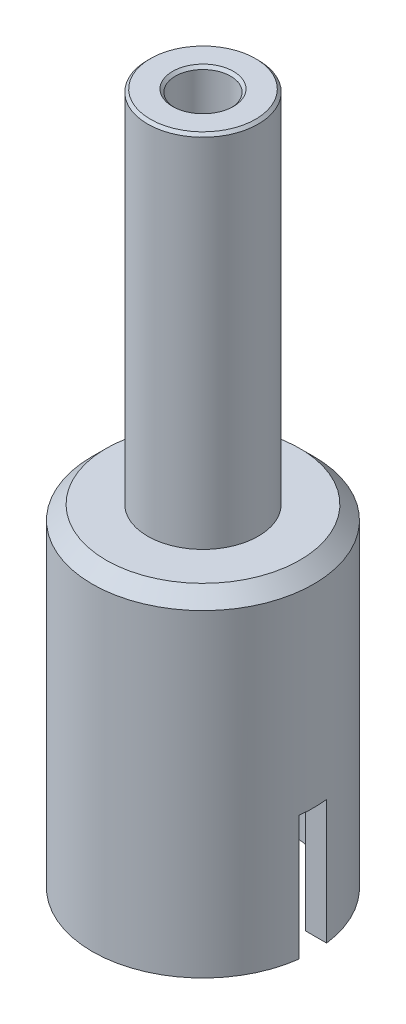
ISO-10303-21;
HEADER;
FILE_DESCRIPTION(('STEP AP214'),'2;1');
FILE_NAME('part.step','',(''),(''),'','','');
FILE_SCHEMA(('AUTOMOTIVE_DESIGN { 1 0 10303 214 1 1 1 1 }'));
ENDSEC;
DATA;
#1=APPLICATION_CONTEXT('core data for automotive mechanical design processes');
#2=APPLICATION_PROTOCOL_DEFINITION('international standard','automotive_design',2000,#1);
#3=PRODUCT_CONTEXT('',#1,'mechanical');
#4=PRODUCT('Part','Part','',(#3));
#5=PRODUCT_RELATED_PRODUCT_CATEGORY('part','',(#4));
#6=PRODUCT_DEFINITION_FORMATION('','',#4);
#7=PRODUCT_DEFINITION_CONTEXT('part definition',#1,'design');
#8=PRODUCT_DEFINITION('design','',#6,#7);
#9=PRODUCT_DEFINITION_SHAPE('','',#8);
#10=(LENGTH_UNIT() NAMED_UNIT(*) SI_UNIT(.MILLI.,.METRE.));
#11=(NAMED_UNIT(*) PLANE_ANGLE_UNIT() SI_UNIT($,.RADIAN.));
#12=(NAMED_UNIT(*) SI_UNIT($,.STERADIAN.) SOLID_ANGLE_UNIT());
#13=UNCERTAINTY_MEASURE_WITH_UNIT(LENGTH_MEASURE(1.E-05),#10,'distance_accuracy_value','');
#14=(GEOMETRIC_REPRESENTATION_CONTEXT(3) GLOBAL_UNCERTAINTY_ASSIGNED_CONTEXT((#13)) GLOBAL_UNIT_ASSIGNED_CONTEXT((#10,
#11,#12)) REPRESENTATION_CONTEXT('',''));
#15=CARTESIAN_POINT('',(0.,0.,0.));
#16=DIRECTION('',(0.,0.,1.));
#17=DIRECTION('',(1.,0.,0.));
#18=AXIS2_PLACEMENT_3D('',#15,#16,#17);
#19=CARTESIAN_POINT('',(0.,0.,0.));
#20=DIRECTION('',(0.,1.,0.));
#21=DIRECTION('',(0.,0.,1.));
#22=AXIS2_PLACEMENT_3D('',#19,#20,#21);
#23=PLANE('',#22);
#24=CARTESIAN_POINT('',(0.,0.,0.));
#25=DIRECTION('',(0.,1.,0.));
#26=DIRECTION('',(0.,0.,1.));
#27=AXIS2_PLACEMENT_3D('',#24,#25,#26);
#28=CIRCLE('',#27,40.);
#29=CARTESIAN_POINT('',(39.6862696659689,0.,-5.));
#30=VERTEX_POINT('',#29);
#31=CARTESIAN_POINT('',(-39.6862696659689,0.,-5.));
#32=VERTEX_POINT('',#31);
#33=EDGE_CURVE('E122',#30,#32,#28,.T.);
#34=ORIENTED_EDGE('',*,*,#33,.F.);
#35=DIRECTION('',(1.,0.,0.));
#36=VECTOR('',#35,1.);
#37=CARTESIAN_POINT('',(-44.1687105356388,0.,-5.));
#38=LINE('',#37,#36);
#39=CARTESIAN_POINT('',(32.1130814466628,0.,-5.));
#40=VERTEX_POINT('',#39);
#41=EDGE_CURVE('E115',#40,#30,#38,.T.);
#42=ORIENTED_EDGE('',*,*,#41,.F.);
#43=CARTESIAN_POINT('',(0.,0.,0.));
#44=DIRECTION('',(0.,-1.,0.));
#45=DIRECTION('',(0.,0.,-1.));
#46=AXIS2_PLACEMENT_3D('',#43,#44,#45);
#47=CIRCLE('',#46,32.5);
#48=CARTESIAN_POINT('',(-32.1130814466628,0.,-5.));
#49=VERTEX_POINT('',#48);
#50=EDGE_CURVE('E131',#49,#40,#47,.T.);
#51=ORIENTED_EDGE('',*,*,#50,.F.);
#52=EDGE_CURVE('E170',#32,#49,#38,.T.);
#53=ORIENTED_EDGE('',*,*,#52,.F.);
#54=EDGE_LOOP('',(#34,#42,#51,#53));
#55=FACE_BOUND('',#54,.T.);
#56=ADVANCED_FACE('F32',(#55),#23,.F.);
#57=CARTESIAN_POINT('',(0.,120.,0.));
#58=DIRECTION('',(0.,1.,0.));
#59=DIRECTION('',(0.,0.,1.));
#60=AXIS2_PLACEMENT_3D('',#57,#58,#59);
#61=PLANE('',#60);
#62=CARTESIAN_POINT('',(0.,120.,0.));
#63=DIRECTION('',(0.,1.,0.));
#64=DIRECTION('',(0.,0.,1.));
#65=AXIS2_PLACEMENT_3D('',#62,#63,#64);
#66=CIRCLE('',#65,35.);
#67=CARTESIAN_POINT('',(0.,120.,35.));
#68=VERTEX_POINT('',#67);
#69=EDGE_CURVE('E126',#68,#68,#66,.T.);
#70=ORIENTED_EDGE('',*,*,#69,.T.);
#71=EDGE_LOOP('',(#70));
#72=FACE_BOUND('',#71,.T.);
#73=CARTESIAN_POINT('',(0.,120.,0.));
#74=DIRECTION('',(0.,1.,0.));
#75=DIRECTION('',(0.,0.,1.));
#76=AXIS2_PLACEMENT_3D('',#73,#74,#75);
#77=CIRCLE('',#76,20.);
#78=CARTESIAN_POINT('',(0.,120.,20.));
#79=VERTEX_POINT('',#78);
#80=EDGE_CURVE('E189',#79,#79,#77,.T.);
#81=ORIENTED_EDGE('',*,*,#80,.F.);
#82=EDGE_LOOP('',(#81));
#83=FACE_BOUND('',#82,.T.);
#84=ADVANCED_FACE('F212',(#72,#83),#61,.T.);
#85=CARTESIAN_POINT('',(0.,120.,0.));
#86=DIRECTION('',(0.,-1.,0.));
#87=DIRECTION('',(0.,0.,-1.));
#88=AXIS2_PLACEMENT_3D('',#85,#86,#87);
#89=CYLINDRICAL_SURFACE('',#88,40.);
#90=CARTESIAN_POINT('',(0.,45.,0.));
#91=DIRECTION('',(0.,1.,0.));
#92=DIRECTION('',(0.,0.,1.));
#93=AXIS2_PLACEMENT_3D('',#90,#91,#92);
#94=CIRCLE('',#93,40.);
#95=CARTESIAN_POINT('',(39.6862696659689,45.,5.));
#96=VERTEX_POINT('',#95);
#97=CARTESIAN_POINT('',(39.6862696659689,45.,-5.));
#98=VERTEX_POINT('',#97);
#99=EDGE_CURVE('E105',#96,#98,#94,.T.);
#100=ORIENTED_EDGE('',*,*,#99,.T.);
#101=DIRECTION('',(0.,-1.,0.));
#102=VECTOR('',#101,1.);
#103=CARTESIAN_POINT('',(39.6862696659689,120.,-5.));
#104=LINE('',#103,#102);
#105=EDGE_CURVE('E183',#98,#30,#104,.T.);
#106=ORIENTED_EDGE('',*,*,#105,.T.);
#107=ORIENTED_EDGE('',*,*,#33,.T.);
#108=DIRECTION('',(0.,-1.,0.));
#109=VECTOR('',#108,1.);
#110=CARTESIAN_POINT('',(-39.6862696659689,120.,-5.));
#111=LINE('',#110,#109);
#112=CARTESIAN_POINT('',(-39.6862696659689,45.,-5.));
#113=VERTEX_POINT('',#112);
#114=EDGE_CURVE('E180',#32,#113,#111,.F.);
#115=ORIENTED_EDGE('',*,*,#114,.T.);
#116=CARTESIAN_POINT('',(-39.6862696659689,45.,5.));
#117=VERTEX_POINT('',#116);
#118=EDGE_CURVE('E177',#113,#117,#94,.T.);
#119=ORIENTED_EDGE('',*,*,#118,.T.);
#120=DIRECTION('',(0.,-1.,0.));
#121=VECTOR('',#120,1.);
#122=CARTESIAN_POINT('',(-39.6862696659689,120.,5.));
#123=LINE('',#122,#121);
#124=CARTESIAN_POINT('',(-39.6862696659689,0.,5.));
#125=VERTEX_POINT('',#124);
#126=EDGE_CURVE('E104',#117,#125,#123,.T.);
#127=ORIENTED_EDGE('',*,*,#126,.T.);
#128=CARTESIAN_POINT('',(39.6862696659689,0.,5.));
#129=VERTEX_POINT('',#128);
#130=EDGE_CURVE('E112',#125,#129,#28,.T.);
#131=ORIENTED_EDGE('',*,*,#130,.T.);
#132=DIRECTION('',(0.,-1.,0.));
#133=VECTOR('',#132,1.);
#134=CARTESIAN_POINT('',(39.6862696659689,120.,5.));
#135=LINE('',#134,#133);
#136=EDGE_CURVE('E96',#129,#96,#135,.F.);
#137=ORIENTED_EDGE('',*,*,#136,.T.);
#138=EDGE_LOOP('',(#100,#106,#107,#115,#119,#127,#131,#137));
#139=FACE_BOUND('',#138,.T.);
#140=CARTESIAN_POINT('',(0.,115.,0.));
#141=DIRECTION('',(0.,1.,0.));
#142=DIRECTION('',(0.,0.,1.));
#143=AXIS2_PLACEMENT_3D('',#140,#141,#142);
#144=CIRCLE('',#143,40.);
#145=CARTESIAN_POINT('',(0.,115.,40.));
#146=VERTEX_POINT('',#145);
#147=EDGE_CURVE('E134',#146,#146,#144,.F.);
#148=ORIENTED_EDGE('',*,*,#147,.T.);
#149=EDGE_LOOP('',(#148));
#150=FACE_BOUND('',#149,.T.);
#151=ADVANCED_FACE('F119',(#139,#150),#89,.T.);
#152=ORIENTED_EDGE('',*,*,#130,.F.);
#153=DIRECTION('',(-1.,0.,0.));
#154=VECTOR('',#153,1.);
#155=CARTESIAN_POINT('',(-44.1687105356388,0.,5.));
#156=LINE('',#155,#154);
#157=CARTESIAN_POINT('',(-32.1130814466628,0.,5.));
#158=VERTEX_POINT('',#157);
#159=EDGE_CURVE('E116',#158,#125,#156,.T.);
#160=ORIENTED_EDGE('',*,*,#159,.F.);
#161=CARTESIAN_POINT('',(32.1130814466628,0.,5.));
#162=VERTEX_POINT('',#161);
#163=EDGE_CURVE('E114',#162,#158,#47,.T.);
#164=ORIENTED_EDGE('',*,*,#163,.F.);
#165=EDGE_CURVE('E99',#129,#162,#156,.T.);
#166=ORIENTED_EDGE('',*,*,#165,.F.);
#167=EDGE_LOOP('',(#152,#160,#164,#166));
#168=FACE_BOUND('',#167,.T.);
#169=ADVANCED_FACE('F110',(#168),#23,.F.);
#170=CARTESIAN_POINT('',(0.,110.,0.));
#171=DIRECTION('',(0.,-1.,0.));
#172=DIRECTION('',(0.,0.,-1.));
#173=AXIS2_PLACEMENT_3D('',#170,#171,#172);
#174=CYLINDRICAL_SURFACE('',#173,32.5);
#175=CARTESIAN_POINT('',(0.,45.,0.));
#176=DIRECTION('',(0.,1.,0.));
#177=DIRECTION('',(0.,0.,1.));
#178=AXIS2_PLACEMENT_3D('',#175,#176,#177);
#179=CIRCLE('',#178,32.5);
#180=CARTESIAN_POINT('',(-32.1130814466628,45.,5.));
#181=VERTEX_POINT('',#180);
#182=CARTESIAN_POINT('',(-32.1130814466628,45.,-5.));
#183=VERTEX_POINT('',#182);
#184=EDGE_CURVE('E153',#181,#183,#179,.F.);
#185=ORIENTED_EDGE('',*,*,#184,.T.);
#186=DIRECTION('',(0.,-1.,0.));
#187=VECTOR('',#186,1.);
#188=CARTESIAN_POINT('',(-32.1130814466628,110.,-5.));
#189=LINE('',#188,#187);
#190=EDGE_CURVE('E11',#183,#49,#189,.T.);
#191=ORIENTED_EDGE('',*,*,#190,.T.);
#192=ORIENTED_EDGE('',*,*,#50,.T.);
#193=DIRECTION('',(0.,-1.,0.));
#194=VECTOR('',#193,1.);
#195=CARTESIAN_POINT('',(32.1130814466628,110.,-5.));
#196=LINE('',#195,#194);
#197=CARTESIAN_POINT('',(32.1130814466628,45.,-5.));
#198=VERTEX_POINT('',#197);
#199=EDGE_CURVE('E155',#40,#198,#196,.F.);
#200=ORIENTED_EDGE('',*,*,#199,.T.);
#201=CARTESIAN_POINT('',(32.1130814466628,45.,5.));
#202=VERTEX_POINT('',#201);
#203=EDGE_CURVE('E149',#198,#202,#179,.F.);
#204=ORIENTED_EDGE('',*,*,#203,.T.);
#205=DIRECTION('',(0.,-1.,0.));
#206=VECTOR('',#205,1.);
#207=CARTESIAN_POINT('',(32.1130814466628,110.,5.));
#208=LINE('',#207,#206);
#209=EDGE_CURVE('E152',#202,#162,#208,.T.);
#210=ORIENTED_EDGE('',*,*,#209,.T.);
#211=ORIENTED_EDGE('',*,*,#163,.T.);
#212=DIRECTION('',(0.,-1.,0.));
#213=VECTOR('',#212,1.);
#214=CARTESIAN_POINT('',(-32.1130814466628,110.,5.));
#215=LINE('',#214,#213);
#216=EDGE_CURVE('E40',#158,#181,#215,.F.);
#217=ORIENTED_EDGE('',*,*,#216,.T.);
#218=EDGE_LOOP('',(#185,#191,#192,#200,#204,#210,#211,#217));
#219=FACE_BOUND('',#218,.T.);
#220=CARTESIAN_POINT('',(0.,110.,0.));
#221=DIRECTION('',(0.,-1.,0.));
#222=DIRECTION('',(0.,0.,-1.));
#223=AXIS2_PLACEMENT_3D('',#220,#221,#222);
#224=CIRCLE('',#223,32.5);
#225=CARTESIAN_POINT('',(0.,110.,-32.5));
#226=VERTEX_POINT('',#225);
#227=EDGE_CURVE('E123',#226,#226,#224,.T.);
#228=ORIENTED_EDGE('',*,*,#227,.F.);
#229=EDGE_LOOP('',(#228));
#230=FACE_BOUND('',#229,.T.);
#231=ADVANCED_FACE('F160',(#219,#230),#174,.F.);
#232=CARTESIAN_POINT('',(0.,110.,0.));
#233=DIRECTION('',(0.,-1.,0.));
#234=DIRECTION('',(0.,0.,-1.));
#235=AXIS2_PLACEMENT_3D('',#232,#233,#234);
#236=PLANE('',#235);
#237=CARTESIAN_POINT('',(0.,110.,0.));
#238=DIRECTION('',(0.,-1.,0.));
#239=DIRECTION('',(0.,0.,-1.));
#240=AXIS2_PLACEMENT_3D('',#237,#238,#239);
#241=CIRCLE('',#240,10.);
#242=CARTESIAN_POINT('',(0.,110.,-10.));
#243=VERTEX_POINT('',#242);
#244=EDGE_CURVE('E186',#243,#243,#241,.T.);
#245=ORIENTED_EDGE('',*,*,#244,.F.);
#246=EDGE_LOOP('',(#245));
#247=FACE_BOUND('',#246,.T.);
#248=ORIENTED_EDGE('',*,*,#227,.T.);
#249=EDGE_LOOP('',(#248));
#250=FACE_BOUND('',#249,.T.);
#251=ADVANCED_FACE('F225',(#247,#250),#236,.T.);
#252=CARTESIAN_POINT('',(0.,120.,0.));
#253=DIRECTION('',(0.,-1.,0.));
#254=DIRECTION('',(0.,0.,-1.));
#255=AXIS2_PLACEMENT_3D('',#252,#253,#254);
#256=CONICAL_SURFACE('',#255,35.,0.785398163397446);
#257=ORIENTED_EDGE('',*,*,#147,.F.);
#258=EDGE_LOOP('',(#257));
#259=FACE_BOUND('',#258,.T.);
#260=ORIENTED_EDGE('',*,*,#69,.F.);
#261=EDGE_LOOP('',(#260));
#262=FACE_BOUND('',#261,.T.);
#263=ADVANCED_FACE('F230',(#259,#262),#256,.T.);
#264=CARTESIAN_POINT('',(0.,250.,0.));
#265=DIRECTION('',(0.,-1.,0.));
#266=DIRECTION('',(0.,0.,-1.));
#267=AXIS2_PLACEMENT_3D('',#264,#265,#266);
#268=CYLINDRICAL_SURFACE('',#267,20.);
#269=CARTESIAN_POINT('',(0.,249.,0.));
#270=DIRECTION('',(0.,1.,0.));
#271=DIRECTION('',(0.,0.,1.));
#272=AXIS2_PLACEMENT_3D('',#269,#270,#271);
#273=CIRCLE('',#272,20.);
#274=CARTESIAN_POINT('',(0.,249.,20.));
#275=VERTEX_POINT('',#274);
#276=EDGE_CURVE('E146',#275,#275,#273,.F.);
#277=ORIENTED_EDGE('',*,*,#276,.T.);
#278=EDGE_LOOP('',(#277));
#279=FACE_BOUND('',#278,.T.);
#280=ORIENTED_EDGE('',*,*,#80,.T.);
#281=EDGE_LOOP('',(#280));
#282=FACE_BOUND('',#281,.T.);
#283=ADVANCED_FACE('F232',(#279,#282),#268,.T.);
#284=CARTESIAN_POINT('',(0.,250.,0.));
#285=DIRECTION('',(0.,1.,0.));
#286=DIRECTION('',(0.,0.,1.));
#287=AXIS2_PLACEMENT_3D('',#284,#285,#286);
#288=PLANE('',#287);
#289=CARTESIAN_POINT('',(0.,250.,0.));
#290=DIRECTION('',(0.,1.,0.));
#291=DIRECTION('',(0.,0.,1.));
#292=AXIS2_PLACEMENT_3D('',#289,#290,#291);
#293=CIRCLE('',#292,11.);
#294=CARTESIAN_POINT('',(0.,250.,11.));
#295=VERTEX_POINT('',#294);
#296=EDGE_CURVE('E143',#295,#295,#293,.F.);
#297=ORIENTED_EDGE('',*,*,#296,.T.);
#298=EDGE_LOOP('',(#297));
#299=FACE_BOUND('',#298,.T.);
#300=CARTESIAN_POINT('',(0.,250.,0.));
#301=DIRECTION('',(0.,1.,0.));
#302=DIRECTION('',(0.,0.,1.));
#303=AXIS2_PLACEMENT_3D('',#300,#301,#302);
#304=CIRCLE('',#303,18.9999999999999);
#305=CARTESIAN_POINT('',(0.,250.,18.9999999999999));
#306=VERTEX_POINT('',#305);
#307=EDGE_CURVE('E140',#306,#306,#304,.T.);
#308=ORIENTED_EDGE('',*,*,#307,.T.);
#309=EDGE_LOOP('',(#308));
#310=FACE_BOUND('',#309,.T.);
#311=ADVANCED_FACE('F243',(#299,#310),#288,.T.);
#312=CARTESIAN_POINT('',(0.,0.,0.));
#313=DIRECTION('',(0.,1.,0.));
#314=DIRECTION('',(0.,0.,1.));
#315=AXIS2_PLACEMENT_3D('',#312,#313,#314);
#316=CYLINDRICAL_SURFACE('',#315,10.);
#317=CARTESIAN_POINT('',(0.,249.,0.));
#318=DIRECTION('',(0.,1.,0.));
#319=DIRECTION('',(0.,0.,1.));
#320=AXIS2_PLACEMENT_3D('',#317,#318,#319);
#321=CIRCLE('',#320,10.);
#322=CARTESIAN_POINT('',(0.,249.,10.));
#323=VERTEX_POINT('',#322);
#324=EDGE_CURVE('E137',#323,#323,#321,.T.);
#325=ORIENTED_EDGE('',*,*,#324,.T.);
#326=EDGE_LOOP('',(#325));
#327=FACE_BOUND('',#326,.T.);
#328=ORIENTED_EDGE('',*,*,#244,.T.);
#329=EDGE_LOOP('',(#328));
#330=FACE_BOUND('',#329,.T.);
#331=ADVANCED_FACE('F236',(#327,#330),#316,.F.);
#332=CARTESIAN_POINT('',(0.,249.,0.));
#333=DIRECTION('',(0.,1.,0.));
#334=DIRECTION('',(0.,0.,1.));
#335=AXIS2_PLACEMENT_3D('',#332,#333,#334);
#336=CONICAL_SURFACE('',#335,10.,0.785398163397439);
#337=ORIENTED_EDGE('',*,*,#296,.F.);
#338=EDGE_LOOP('',(#337));
#339=FACE_BOUND('',#338,.T.);
#340=ORIENTED_EDGE('',*,*,#324,.F.);
#341=EDGE_LOOP('',(#340));
#342=FACE_BOUND('',#341,.T.);
#343=ADVANCED_FACE('F234',(#339,#342),#336,.F.);
#344=CARTESIAN_POINT('',(0.,250.,0.));
#345=DIRECTION('',(0.,-1.,0.));
#346=DIRECTION('',(0.,0.,-1.));
#347=AXIS2_PLACEMENT_3D('',#344,#345,#346);
#348=CONICAL_SURFACE('',#347,18.9999999999999,0.785398163397453);
#349=ORIENTED_EDGE('',*,*,#276,.F.);
#350=EDGE_LOOP('',(#349));
#351=FACE_BOUND('',#350,.T.);
#352=ORIENTED_EDGE('',*,*,#307,.F.);
#353=EDGE_LOOP('',(#352));
#354=FACE_BOUND('',#353,.T.);
#355=ADVANCED_FACE('F34',(#351,#354),#348,.T.);
#356=CARTESIAN_POINT('',(44.1687105356389,45.,5.));
#357=DIRECTION('',(0.,1.,0.));
#358=DIRECTION('',(0.,0.,1.));
#359=AXIS2_PLACEMENT_3D('',#356,#357,#358);
#360=PLANE('',#359);
#361=DIRECTION('',(-1.,0.,0.));
#362=VECTOR('',#361,1.);
#363=CARTESIAN_POINT('',(-44.1687105356388,45.,5.));
#364=LINE('',#363,#362);
#365=EDGE_CURVE('E55',#96,#202,#364,.T.);
#366=ORIENTED_EDGE('',*,*,#365,.T.);
#367=ORIENTED_EDGE('',*,*,#203,.F.);
#368=DIRECTION('',(1.,0.,0.));
#369=VECTOR('',#368,1.);
#370=CARTESIAN_POINT('',(-44.1687105356388,45.,-5.));
#371=LINE('',#370,#369);
#372=EDGE_CURVE('E172',#198,#98,#371,.T.);
#373=ORIENTED_EDGE('',*,*,#372,.T.);
#374=ORIENTED_EDGE('',*,*,#99,.F.);
#375=EDGE_LOOP('',(#366,#367,#373,#374));
#376=FACE_BOUND('',#375,.T.);
#377=ADVANCED_FACE('F194',(#376),#360,.F.);
#378=CARTESIAN_POINT('',(-44.1687105356388,45.,5.));
#379=DIRECTION('',(0.,0.,1.));
#380=DIRECTION('',(1.,0.,0.));
#381=AXIS2_PLACEMENT_3D('',#378,#379,#380);
#382=PLANE('',#381);
#383=ORIENTED_EDGE('',*,*,#165,.T.);
#384=ORIENTED_EDGE('',*,*,#209,.F.);
#385=ORIENTED_EDGE('',*,*,#365,.F.);
#386=ORIENTED_EDGE('',*,*,#136,.F.);
#387=EDGE_LOOP('',(#383,#384,#385,#386));
#388=FACE_BOUND('',#387,.T.);
#389=ADVANCED_FACE('F98',(#388),#382,.F.);
#390=CARTESIAN_POINT('',(-44.1687105356388,45.,-5.));
#391=DIRECTION('',(0.,0.,-1.));
#392=DIRECTION('',(-1.,0.,0.));
#393=AXIS2_PLACEMENT_3D('',#390,#391,#392);
#394=PLANE('',#393);
#395=ORIENTED_EDGE('',*,*,#372,.F.);
#396=ORIENTED_EDGE('',*,*,#199,.F.);
#397=ORIENTED_EDGE('',*,*,#41,.T.);
#398=ORIENTED_EDGE('',*,*,#105,.F.);
#399=EDGE_LOOP('',(#395,#396,#397,#398));
#400=FACE_BOUND('',#399,.T.);
#401=ADVANCED_FACE('F196',(#400),#394,.F.);
#402=ORIENTED_EDGE('',*,*,#52,.T.);
#403=ORIENTED_EDGE('',*,*,#190,.F.);
#404=EDGE_CURVE('E47',#113,#183,#371,.T.);
#405=ORIENTED_EDGE('',*,*,#404,.F.);
#406=ORIENTED_EDGE('',*,*,#114,.F.);
#407=EDGE_LOOP('',(#402,#403,#405,#406));
#408=FACE_BOUND('',#407,.T.);
#409=ADVANCED_FACE('F202',(#408),#394,.F.);
#410=EDGE_CURVE('E167',#181,#117,#364,.T.);
#411=ORIENTED_EDGE('',*,*,#410,.F.);
#412=ORIENTED_EDGE('',*,*,#216,.F.);
#413=ORIENTED_EDGE('',*,*,#159,.T.);
#414=ORIENTED_EDGE('',*,*,#126,.F.);
#415=EDGE_LOOP('',(#411,#412,#413,#414));
#416=FACE_BOUND('',#415,.T.);
#417=ADVANCED_FACE('F169',(#416),#382,.F.);
#418=ORIENTED_EDGE('',*,*,#404,.T.);
#419=ORIENTED_EDGE('',*,*,#184,.F.);
#420=ORIENTED_EDGE('',*,*,#410,.T.);
#421=ORIENTED_EDGE('',*,*,#118,.F.);
#422=EDGE_LOOP('',(#418,#419,#420,#421));
#423=FACE_BOUND('',#422,.T.);
#424=ADVANCED_FACE('F166',(#423),#360,.F.);
#425=CLOSED_SHELL('',(#56,#84,#151,#169,#231,#251,#263,#283,#311,#331,#343,#355,#377,#389,#401,
#409,#417,#424));
#426=MANIFOLD_SOLID_BREP('B2',#425);
#427=ADVANCED_BREP_SHAPE_REPRESENTATION('',(#18,#426),#14);
#428=SHAPE_DEFINITION_REPRESENTATION(#9,#427);
ENDSEC;
END-ISO-10303-21;
